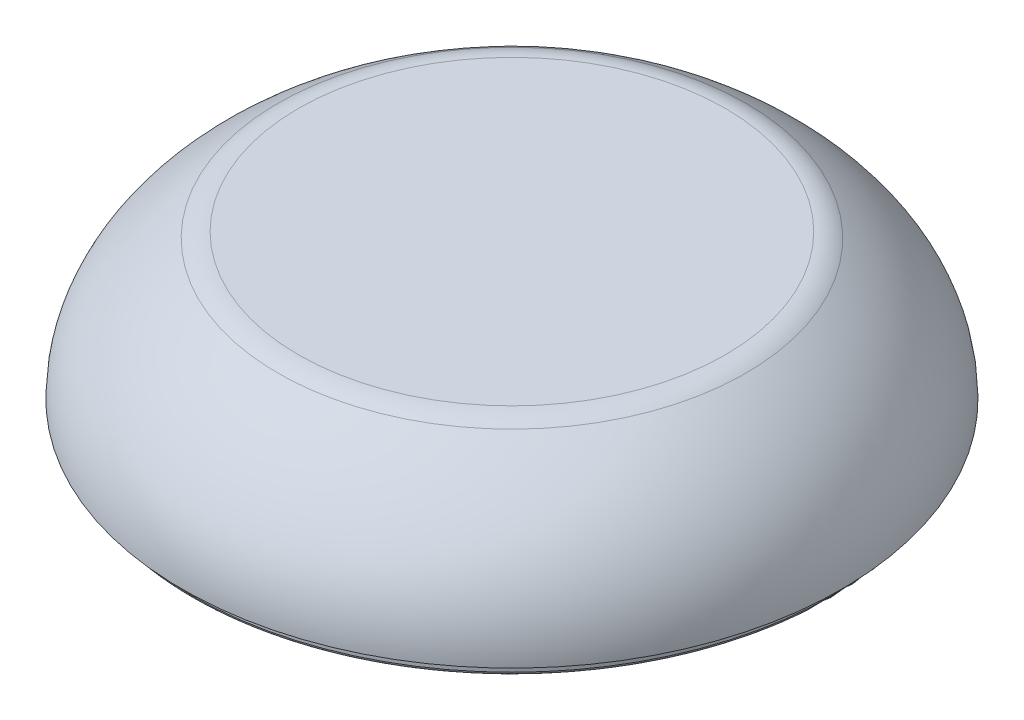
ISO-10303-21;
HEADER;
FILE_DESCRIPTION(('STEP AP214'),'2;1');
FILE_NAME('part.step','',(''),(''),'','','');
FILE_SCHEMA(('AUTOMOTIVE_DESIGN { 1 0 10303 214 1 1 1 1 }'));
ENDSEC;
DATA;
#1=APPLICATION_CONTEXT('core data for automotive mechanical design processes');
#2=APPLICATION_PROTOCOL_DEFINITION('international standard','automotive_design',2000,#1);
#3=PRODUCT_CONTEXT('',#1,'mechanical');
#4=PRODUCT('Part','Part','',(#3));
#5=PRODUCT_RELATED_PRODUCT_CATEGORY('part','',(#4));
#6=PRODUCT_DEFINITION_FORMATION('','',#4);
#7=PRODUCT_DEFINITION_CONTEXT('part definition',#1,'design');
#8=PRODUCT_DEFINITION('design','',#6,#7);
#9=PRODUCT_DEFINITION_SHAPE('','',#8);
#10=(LENGTH_UNIT() NAMED_UNIT(*) SI_UNIT(.MILLI.,.METRE.));
#11=(NAMED_UNIT(*) PLANE_ANGLE_UNIT() SI_UNIT($,.RADIAN.));
#12=(NAMED_UNIT(*) SI_UNIT($,.STERADIAN.) SOLID_ANGLE_UNIT());
#13=UNCERTAINTY_MEASURE_WITH_UNIT(LENGTH_MEASURE(1.E-05),#10,'distance_accuracy_value','');
#14=(GEOMETRIC_REPRESENTATION_CONTEXT(3) GLOBAL_UNCERTAINTY_ASSIGNED_CONTEXT((#13)) GLOBAL_UNIT_ASSIGNED_CONTEXT((#10,
#11,#12)) REPRESENTATION_CONTEXT('',''));
#15=CARTESIAN_POINT('',(0.,0.,0.));
#16=DIRECTION('',(0.,0.,1.));
#17=DIRECTION('',(1.,0.,0.));
#18=AXIS2_PLACEMENT_3D('',#15,#16,#17);
#19=CARTESIAN_POINT('',(0.,0.,0.));
#20=DIRECTION('',(0.,-1.,0.));
#21=DIRECTION('',(0.,0.,-1.));
#22=AXIS2_PLACEMENT_3D('',#19,#20,#21);
#23=PLANE('',#22);
#24=CARTESIAN_POINT('',(0.,1.96166204035086E-13,0.));
#25=DIRECTION('',(0.,-1.,0.));
#26=DIRECTION('',(0.,0.,-1.));
#27=AXIS2_PLACEMENT_3D('',#24,#25,#26);
#28=CIRCLE('',#27,50.);
#29=CARTESIAN_POINT('',(0.,1.96166204035086E-13,-50.));
#30=VERTEX_POINT('',#29);
#31=EDGE_CURVE('E75',#30,#30,#28,.T.);
#32=ORIENTED_EDGE('',*,*,#31,.T.);
#33=EDGE_LOOP('',(#32));
#34=FACE_BOUND('',#33,.T.);
#35=CARTESIAN_POINT('',(0.,0.,0.));
#36=DIRECTION('',(0.,-1.,0.));
#37=DIRECTION('',(0.,0.,-1.));
#38=AXIS2_PLACEMENT_3D('',#35,#36,#37);
#39=CIRCLE('',#38,48.5);
#40=CARTESIAN_POINT('',(0.,0.,-48.5));
#41=VERTEX_POINT('',#40);
#42=EDGE_CURVE('E119',#41,#41,#39,.T.);
#43=ORIENTED_EDGE('',*,*,#42,.F.);
#44=EDGE_LOOP('',(#43));
#45=FACE_BOUND('',#44,.T.);
#46=ADVANCED_FACE('F43',(#34,#45),#23,.T.);
#47=CARTESIAN_POINT('',(0.,0.,0.));
#48=DIRECTION('',(0.,0.,1.));
#49=DIRECTION('',(-1.,0.,0.));
#50=AXIS2_PLACEMENT_3D('',#47,#48,#49);
#51=ELLIPSE('',#50,50.,30.);
#52=TRIMMED_CURVE('',#51,(PARAMETER_VALUE(1.5707963267949)),(PARAMETER_VALUE(4.71238898038469)),
.T.,.PARAMETER.);
#53=CARTESIAN_POINT('',(0.,0.,0.));
#54=DIRECTION('',(0.,-1.,0.));
#55=AXIS1_PLACEMENT('',#53,#54);
#56=SURFACE_OF_REVOLUTION('',#52,#55);
#57=CARTESIAN_POINT('',(0.,21.1348736570542,0.));
#58=DIRECTION('',(0.,-1.,0.));
#59=DIRECTION('',(0.,0.,-1.));
#60=AXIS2_PLACEMENT_3D('',#57,#58,#59);
#61=CIRCLE('',#60,35.4854084057548);
#62=CARTESIAN_POINT('',(0.,21.1348736570542,-35.4854084057548));
#63=VERTEX_POINT('',#62);
#64=EDGE_CURVE('E51',#63,#63,#61,.T.);
#65=ORIENTED_EDGE('',*,*,#64,.T.);
#66=EDGE_LOOP('',(#65));
#67=FACE_BOUND('',#66,.T.);
#68=ORIENTED_EDGE('',*,*,#31,.F.);
#69=EDGE_LOOP('',(#68));
#70=FACE_BOUND('',#69,.T.);
#71=ADVANCED_FACE('F85',(#67,#70),#56,.F.);
#72=CARTESIAN_POINT('',(0.,22.,0.));
#73=DIRECTION('',(0.,1.,0.));
#74=DIRECTION('',(0.,0.,1.));
#75=AXIS2_PLACEMENT_3D('',#72,#73,#74);
#76=PLANE('',#75);
#77=CARTESIAN_POINT('',(0.,22.,0.));
#78=DIRECTION('',(0.,1.,0.));
#79=DIRECTION('',(0.,0.,1.));
#80=AXIS2_PLACEMENT_3D('',#77,#78,#79);
#81=CIRCLE('',#80,32.381689261552);
#82=CARTESIAN_POINT('',(0.,22.,32.381689261552));
#83=VERTEX_POINT('',#82);
#84=EDGE_CURVE('E11',#83,#83,#81,.T.);
#85=ORIENTED_EDGE('',*,*,#84,.T.);
#86=EDGE_LOOP('',(#85));
#87=FACE_BOUND('',#86,.T.);
#88=ADVANCED_FACE('F89',(#87),#76,.T.);
#89=CARTESIAN_POINT('',(0.,-2.,0.));
#90=DIRECTION('',(0.,-1.,0.));
#91=DIRECTION('',(0.,0.,-1.));
#92=AXIS2_PLACEMENT_3D('',#89,#90,#91);
#93=PLANE('',#92);
#94=CARTESIAN_POINT('',(0.,-2.,0.));
#95=DIRECTION('',(0.,-1.,0.));
#96=DIRECTION('',(0.,0.,-1.));
#97=AXIS2_PLACEMENT_3D('',#94,#95,#96);
#98=CIRCLE('',#97,48.1);
#99=CARTESIAN_POINT('',(0.,-2.,-48.1));
#100=VERTEX_POINT('',#99);
#101=EDGE_CURVE('E61',#100,#100,#98,.T.);
#102=ORIENTED_EDGE('',*,*,#101,.T.);
#103=EDGE_LOOP('',(#102));
#104=FACE_BOUND('',#103,.T.);
#105=CARTESIAN_POINT('',(0.,-2.,0.));
#106=DIRECTION('',(0.,-1.,0.));
#107=DIRECTION('',(0.,0.,-1.));
#108=AXIS2_PLACEMENT_3D('',#105,#106,#107);
#109=CIRCLE('',#108,47.);
#110=CARTESIAN_POINT('',(0.,-2.,-47.));
#111=VERTEX_POINT('',#110);
#112=EDGE_CURVE('E116',#111,#111,#109,.T.);
#113=ORIENTED_EDGE('',*,*,#112,.F.);
#114=EDGE_LOOP('',(#113));
#115=FACE_BOUND('',#114,.T.);
#116=ADVANCED_FACE('F109',(#104,#115),#93,.T.);
#117=CARTESIAN_POINT('',(0.,-2.,0.));
#118=DIRECTION('',(0.,1.,0.));
#119=DIRECTION('',(0.,0.,1.));
#120=AXIS2_PLACEMENT_3D('',#117,#118,#119);
#121=CYLINDRICAL_SURFACE('',#120,48.5);
#122=CARTESIAN_POINT('',(0.,-1.6,0.));
#123=DIRECTION('',(0.,-1.,0.));
#124=DIRECTION('',(0.,0.,-1.));
#125=AXIS2_PLACEMENT_3D('',#122,#123,#124);
#126=CIRCLE('',#125,48.5);
#127=CARTESIAN_POINT('',(0.,-1.6,-48.5));
#128=VERTEX_POINT('',#127);
#129=EDGE_CURVE('E56',#128,#128,#126,.F.);
#130=ORIENTED_EDGE('',*,*,#129,.T.);
#131=EDGE_LOOP('',(#130));
#132=FACE_BOUND('',#131,.T.);
#133=ORIENTED_EDGE('',*,*,#42,.T.);
#134=EDGE_LOOP('',(#133));
#135=FACE_BOUND('',#134,.T.);
#136=ADVANCED_FACE('F112',(#132,#135),#121,.T.);
#137=CARTESIAN_POINT('',(0.,-2.,0.));
#138=DIRECTION('',(0.,1.,0.));
#139=DIRECTION('',(0.,0.,1.));
#140=AXIS2_PLACEMENT_3D('',#137,#138,#139);
#141=CYLINDRICAL_SURFACE('',#140,47.);
#142=CARTESIAN_POINT('',(0.,3.5575533023759,0.));
#143=DIRECTION('',(0.,-1.,0.));
#144=DIRECTION('',(0.,0.,-1.));
#145=AXIS2_PLACEMENT_3D('',#142,#143,#144);
#146=CIRCLE('',#145,47.);
#147=CARTESIAN_POINT('',(0.,3.5575533023759,-47.));
#148=VERTEX_POINT('',#147);
#149=EDGE_CURVE('E67',#148,#148,#146,.F.);
#150=ORIENTED_EDGE('',*,*,#149,.T.);
#151=EDGE_LOOP('',(#150));
#152=FACE_BOUND('',#151,.T.);
#153=ORIENTED_EDGE('',*,*,#112,.T.);
#154=EDGE_LOOP('',(#153));
#155=FACE_BOUND('',#154,.T.);
#156=ADVANCED_FACE('F136',(#152,#155),#141,.F.);
#157=CARTESIAN_POINT('',(0.,20.,0.));
#158=DIRECTION('',(0.,1.,0.));
#159=DIRECTION('',(0.,0.,1.));
#160=AXIS2_PLACEMENT_3D('',#157,#158,#159);
#161=PLANE('',#160);
#162=CARTESIAN_POINT('',(0.,20.,0.));
#163=DIRECTION('',(0.,-1.,0.));
#164=DIRECTION('',(0.,0.,-1.));
#165=AXIS2_PLACEMENT_3D('',#162,#163,#164);
#166=CIRCLE('',#165,33.4688576471915);
#167=CARTESIAN_POINT('',(0.,20.,-33.4688576471915));
#168=VERTEX_POINT('',#167);
#169=EDGE_CURVE('E79',#168,#168,#166,.T.);
#170=ORIENTED_EDGE('',*,*,#169,.T.);
#171=EDGE_LOOP('',(#170));
#172=FACE_BOUND('',#171,.T.);
#173=ADVANCED_FACE('F128',(#172),#161,.F.);
#174=CARTESIAN_POINT('',(0.,0.,0.));
#175=DIRECTION('',(0.,0.,1.));
#176=DIRECTION('',(-1.,0.,0.));
#177=AXIS2_PLACEMENT_3D('',#174,#175,#176);
#178=ELLIPSE('',#177,50.,30.);
#179=TRIMMED_CURVE('',#178,(PARAMETER_VALUE(1.5707963267949)),
(PARAMETER_VALUE(4.71238898038469)),.T.,.PARAMETER.);
#180=CARTESIAN_POINT('',(0.,0.,0.));
#181=DIRECTION('',(0.,-1.,0.));
#182=AXIS1_PLACEMENT('',#180,#181);
#183=SURFACE_OF_REVOLUTION('',#179,#182);
#184=OFFSET_SURFACE('',#183,2.,.F.);
#185=CARTESIAN_POINT('',(0.,8.32072714975295,0.));
#186=DIRECTION('',(0.,-1.,0.));
#187=DIRECTION('',(0.,0.,-1.));
#188=AXIS2_PLACEMENT_3D('',#185,#186,#187);
#189=CIRCLE('',#188,45.79273421068);
#190=CARTESIAN_POINT('',(0.,8.32072714975295,-45.79273421068));
#191=VERTEX_POINT('',#190);
#192=EDGE_CURVE('E71',#191,#191,#189,.T.);
#193=ORIENTED_EDGE('',*,*,#192,.T.);
#194=EDGE_LOOP('',(#193));
#195=FACE_BOUND('',#194,.T.);
#196=ORIENTED_EDGE('',*,*,#169,.F.);
#197=EDGE_LOOP('',(#196));
#198=FACE_BOUND('',#197,.T.);
#199=ADVANCED_FACE('F97',(#195,#198),#184,.T.);
#200=CARTESIAN_POINT('',(0.,3.5575533023759,0.));
#201=DIRECTION('',(0.,-1.,0.));
#202=DIRECTION('',(0.,0.,-1.));
#203=AXIS2_PLACEMENT_3D('',#200,#201,#202);
#204=TOROIDAL_SURFACE('',#203,37.,10.);
#205=ORIENTED_EDGE('',*,*,#149,.F.);
#206=EDGE_LOOP('',(#205));
#207=FACE_BOUND('',#206,.T.);
#208=ORIENTED_EDGE('',*,*,#192,.F.);
#209=EDGE_LOOP('',(#208));
#210=FACE_BOUND('',#209,.T.);
#211=ADVANCED_FACE('F94',(#207,#210),#204,.F.);
#212=CARTESIAN_POINT('',(0.,-1.6,0.));
#213=DIRECTION('',(0.,-1.,0.));
#214=DIRECTION('',(0.,0.,-1.));
#215=AXIS2_PLACEMENT_3D('',#212,#213,#214);
#216=TOROIDAL_SURFACE('',#215,48.1,0.4);
#217=ORIENTED_EDGE('',*,*,#129,.F.);
#218=EDGE_LOOP('',(#217));
#219=FACE_BOUND('',#218,.T.);
#220=ORIENTED_EDGE('',*,*,#101,.F.);
#221=EDGE_LOOP('',(#220));
#222=FACE_BOUND('',#221,.T.);
#223=ADVANCED_FACE('F96',(#219,#222),#216,.T.);
#224=CARTESIAN_POINT('',(0.,16.,0.));
#225=DIRECTION('',(0.,-1.,0.));
#226=DIRECTION('',(0.,0.,-1.));
#227=AXIS2_PLACEMENT_3D('',#224,#225,#226);
#228=TOROIDAL_SURFACE('',#227,32.381689261552,6.);
#229=ORIENTED_EDGE('',*,*,#84,.F.);
#230=EDGE_LOOP('',(#229));
#231=FACE_BOUND('',#230,.T.);
#232=ORIENTED_EDGE('',*,*,#64,.F.);
#233=EDGE_LOOP('',(#232));
#234=FACE_BOUND('',#233,.T.);
#235=ADVANCED_FACE('F45',(#231,#234),#228,.T.);
#236=CLOSED_SHELL('',(#46,#71,#88,#116,#136,#156,#173,#199,#211,#223,#235));
#237=MANIFOLD_SOLID_BREP('B2',#236);
#238=ADVANCED_BREP_SHAPE_REPRESENTATION('',(#18,#237),#14);
#239=SHAPE_DEFINITION_REPRESENTATION(#9,#238);
ENDSEC;
END-ISO-10303-21;
